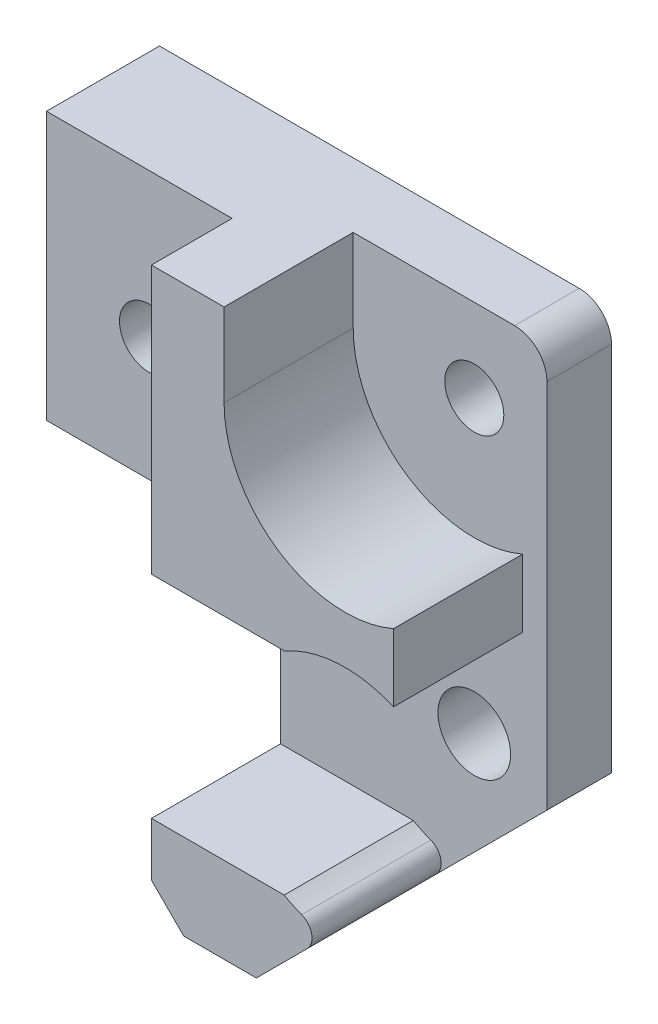
ISO-10303-21;
HEADER;
FILE_DESCRIPTION(('STEP AP214'),'2;1');
FILE_NAME('part.step','',(''),(''),'','','');
FILE_SCHEMA(('AUTOMOTIVE_DESIGN { 1 0 10303 214 1 1 1 1 }'));
ENDSEC;
DATA;
#1=APPLICATION_CONTEXT('core data for automotive mechanical design processes');
#2=APPLICATION_PROTOCOL_DEFINITION('international standard','automotive_design',2000,#1);
#3=PRODUCT_CONTEXT('',#1,'mechanical');
#4=PRODUCT('Part','Part','',(#3));
#5=PRODUCT_RELATED_PRODUCT_CATEGORY('part','',(#4));
#6=PRODUCT_DEFINITION_FORMATION('','',#4);
#7=PRODUCT_DEFINITION_CONTEXT('part definition',#1,'design');
#8=PRODUCT_DEFINITION('design','',#6,#7);
#9=PRODUCT_DEFINITION_SHAPE('','',#8);
#10=(LENGTH_UNIT() NAMED_UNIT(*) SI_UNIT(.MILLI.,.METRE.));
#11=(NAMED_UNIT(*) PLANE_ANGLE_UNIT() SI_UNIT($,.RADIAN.));
#12=(NAMED_UNIT(*) SI_UNIT($,.STERADIAN.) SOLID_ANGLE_UNIT());
#13=UNCERTAINTY_MEASURE_WITH_UNIT(LENGTH_MEASURE(1.E-05),#10,'distance_accuracy_value','');
#14=(GEOMETRIC_REPRESENTATION_CONTEXT(3) GLOBAL_UNCERTAINTY_ASSIGNED_CONTEXT((#13)) GLOBAL_UNIT_ASSIGNED_CONTEXT((#10,
#11,#12)) REPRESENTATION_CONTEXT('',''));
#15=CARTESIAN_POINT('',(0.,0.,0.));
#16=DIRECTION('',(0.,0.,1.));
#17=DIRECTION('',(1.,0.,0.));
#18=AXIS2_PLACEMENT_3D('',#15,#16,#17);
#19=CARTESIAN_POINT('',(23.5,29.8639610306789,8.));
#20=DIRECTION('',(0.,0.,1.));
#21=DIRECTION('',(-1.,0.,0.));
#22=AXIS2_PLACEMENT_3D('',#19,#20,#21);
#23=PLANE('',#22);
#24=DIRECTION('',(1.,0.,0.));
#25=VECTOR('',#24,1.);
#26=CARTESIAN_POINT('',(0.,18.4139610306789,8.));
#27=LINE('',#26,#25);
#28=CARTESIAN_POINT('',(11.5,18.4139610306789,8.));
#29=VERTEX_POINT('',#28);
#30=CARTESIAN_POINT('',(19.7450033288963,18.4139610306789,8.));
#31=VERTEX_POINT('',#30);
#32=EDGE_CURVE('E311',#29,#31,#27,.T.);
#33=ORIENTED_EDGE('',*,*,#32,.T.);
#34=CARTESIAN_POINT('',(23.5,11.8639610306789,8.));
#35=DIRECTION('',(0.,0.,-1.));
#36=DIRECTION('',(-1.,0.,0.));
#37=AXIS2_PLACEMENT_3D('',#34,#35,#36);
#38=CIRCLE('',#37,7.55);
#39=CARTESIAN_POINT('',(26.5,18.7923446805644,8.));
#40=VERTEX_POINT('',#39);
#41=EDGE_CURVE('E335',#31,#40,#38,.T.);
#42=ORIENTED_EDGE('',*,*,#41,.T.);
#43=DIRECTION('',(0.,-1.,0.));
#44=VECTOR('',#43,1.);
#45=CARTESIAN_POINT('',(26.5,0.,8.));
#46=LINE('',#45,#44);
#47=CARTESIAN_POINT('',(26.5,22.9900974882452,8.));
#48=VERTEX_POINT('',#47);
#49=EDGE_CURVE('E294',#48,#40,#46,.T.);
#50=ORIENTED_EDGE('',*,*,#49,.F.);
#51=CARTESIAN_POINT('',(23.5,29.8639610306789,8.));
#52=DIRECTION('',(0.,0.,-1.));
#53=DIRECTION('',(-1.,0.,0.));
#54=AXIS2_PLACEMENT_3D('',#51,#52,#53);
#55=CIRCLE('',#54,7.5);
#56=CARTESIAN_POINT('',(16.,29.8639610306789,8.));
#57=VERTEX_POINT('',#56);
#58=EDGE_CURVE('E321',#48,#57,#55,.T.);
#59=ORIENTED_EDGE('',*,*,#58,.T.);
#60=DIRECTION('',(0.,1.,0.));
#61=VECTOR('',#60,1.);
#62=CARTESIAN_POINT('',(16.,0.,8.));
#63=LINE('',#62,#61);
#64=CARTESIAN_POINT('',(16.,35.,8.));
#65=VERTEX_POINT('',#64);
#66=EDGE_CURVE('E317',#57,#65,#63,.T.);
#67=ORIENTED_EDGE('',*,*,#66,.T.);
#68=DIRECTION('',(1.,0.,0.));
#69=VECTOR('',#68,1.);
#70=CARTESIAN_POINT('',(0.,35.,8.));
#71=LINE('',#70,#69);
#72=CARTESIAN_POINT('',(11.5,35.,8.));
#73=VERTEX_POINT('',#72);
#74=EDGE_CURVE('E325',#73,#65,#71,.T.);
#75=ORIENTED_EDGE('',*,*,#74,.F.);
#76=DIRECTION('',(0.,1.,0.));
#77=VECTOR('',#76,1.);
#78=CARTESIAN_POINT('',(11.5,0.,8.));
#79=LINE('',#78,#77);
#80=EDGE_CURVE('E255',#29,#73,#79,.T.);
#81=ORIENTED_EDGE('',*,*,#80,.F.);
#82=EDGE_LOOP('',(#33,#42,#50,#59,#67,#75,#81));
#83=FACE_BOUND('',#82,.T.);
#84=ADVANCED_FACE('F36',(#83),#23,.T.);
#85=CARTESIAN_POINT('',(0.,0.,-4.));
#86=DIRECTION('',(1.,0.,0.));
#87=DIRECTION('',(0.,0.,1.));
#88=AXIS2_PLACEMENT_3D('',#85,#86,#87);
#89=PLANE('',#88);
#90=DIRECTION('',(0.,1.,0.));
#91=VECTOR('',#90,1.);
#92=CARTESIAN_POINT('',(0.,0.,3.));
#93=LINE('',#92,#91);
#94=CARTESIAN_POINT('',(0.,18.4139610306789,3.));
#95=VERTEX_POINT('',#94);
#96=CARTESIAN_POINT('',(0.,35.,3.));
#97=VERTEX_POINT('',#96);
#98=EDGE_CURVE('E260',#95,#97,#93,.T.);
#99=ORIENTED_EDGE('',*,*,#98,.T.);
#100=DIRECTION('',(0.,0.,1.));
#101=VECTOR('',#100,1.);
#102=CARTESIAN_POINT('',(0.,35.,-4.));
#103=LINE('',#102,#101);
#104=CARTESIAN_POINT('',(0.,35.,-4.));
#105=VERTEX_POINT('',#104);
#106=EDGE_CURVE('E393',#105,#97,#103,.T.);
#107=ORIENTED_EDGE('',*,*,#106,.F.);
#108=DIRECTION('',(0.,-1.,0.));
#109=VECTOR('',#108,1.);
#110=CARTESIAN_POINT('',(0.,0.,-4.));
#111=LINE('',#110,#109);
#112=CARTESIAN_POINT('',(0.,18.4139610306789,-4.));
#113=VERTEX_POINT('',#112);
#114=EDGE_CURVE('E376',#105,#113,#111,.T.);
#115=ORIENTED_EDGE('',*,*,#114,.T.);
#116=DIRECTION('',(0.,0.,1.));
#117=VECTOR('',#116,1.);
#118=CARTESIAN_POINT('',(0.,18.4139610306789,-4.));
#119=LINE('',#118,#117);
#120=EDGE_CURVE('E288',#113,#95,#119,.T.);
#121=ORIENTED_EDGE('',*,*,#120,.T.);
#122=EDGE_LOOP('',(#99,#107,#115,#121));
#123=FACE_BOUND('',#122,.T.);
#124=ADVANCED_FACE('F466',(#123),#89,.F.);
#125=CARTESIAN_POINT('',(0.,35.,-4.));
#126=DIRECTION('',(0.,-1.,0.));
#127=DIRECTION('',(0.,0.,1.));
#128=AXIS2_PLACEMENT_3D('',#125,#126,#127);
#129=PLANE('',#128);
#130=DIRECTION('',(0.,0.,1.));
#131=VECTOR('',#130,1.);
#132=CARTESIAN_POINT('',(11.5,35.,3.));
#133=LINE('',#132,#131);
#134=CARTESIAN_POINT('',(11.5,35.,3.));
#135=VERTEX_POINT('',#134);
#136=EDGE_CURVE('E272',#135,#73,#133,.T.);
#137=ORIENTED_EDGE('',*,*,#136,.T.);
#138=ORIENTED_EDGE('',*,*,#74,.T.);
#139=DIRECTION('',(0.,0.,-1.));
#140=VECTOR('',#139,1.);
#141=CARTESIAN_POINT('',(16.,35.,51.9004555785017));
#142=LINE('',#141,#140);
#143=CARTESIAN_POINT('',(16.,35.,0.));
#144=VERTEX_POINT('',#143);
#145=EDGE_CURVE('E328',#65,#144,#142,.T.);
#146=ORIENTED_EDGE('',*,*,#145,.T.);
#147=DIRECTION('',(-1.,0.,0.));
#148=VECTOR('',#147,1.);
#149=CARTESIAN_POINT('',(0.,35.,0.));
#150=LINE('',#149,#148);
#151=CARTESIAN_POINT('',(26.,35.,0.));
#152=VERTEX_POINT('',#151);
#153=EDGE_CURVE('E380',#152,#144,#150,.T.);
#154=ORIENTED_EDGE('',*,*,#153,.F.);
#155=DIRECTION('',(0.,0.,1.));
#156=VECTOR('',#155,1.);
#157=CARTESIAN_POINT('',(26.,35.,-4.));
#158=LINE('',#157,#156);
#159=CARTESIAN_POINT('',(26.,35.,-4.));
#160=VERTEX_POINT('',#159);
#161=EDGE_CURVE('E405',#160,#152,#158,.T.);
#162=ORIENTED_EDGE('',*,*,#161,.F.);
#163=DIRECTION('',(-1.,0.,0.));
#164=VECTOR('',#163,1.);
#165=CARTESIAN_POINT('',(0.,35.,-4.));
#166=LINE('',#165,#164);
#167=EDGE_CURVE('E391',#160,#105,#166,.T.);
#168=ORIENTED_EDGE('',*,*,#167,.T.);
#169=ORIENTED_EDGE('',*,*,#106,.T.);
#170=DIRECTION('',(1.,0.,0.));
#171=VECTOR('',#170,1.);
#172=CARTESIAN_POINT('',(0.,35.,3.));
#173=LINE('',#172,#171);
#174=EDGE_CURVE('E263',#97,#135,#173,.T.);
#175=ORIENTED_EDGE('',*,*,#174,.T.);
#176=EDGE_LOOP('',(#137,#138,#146,#154,#162,#168,#169,#175));
#177=FACE_BOUND('',#176,.T.);
#178=ADVANCED_FACE('F472',(#177),#129,.F.);
#179=CARTESIAN_POINT('',(0.,18.4139610306789,51.9004555785017));
#180=DIRECTION('',(0.,-1.,0.));
#181=DIRECTION('',(1.,0.,0.));
#182=AXIS2_PLACEMENT_3D('',#179,#180,#181);
#183=PLANE('',#182);
#184=DIRECTION('',(-1.,0.,0.));
#185=VECTOR('',#184,1.);
#186=CARTESIAN_POINT('',(0.,18.4139610306789,3.));
#187=LINE('',#186,#185);
#188=CARTESIAN_POINT('',(11.5,18.4139610306789,3.));
#189=VERTEX_POINT('',#188);
#190=EDGE_CURVE('E258',#189,#95,#187,.T.);
#191=ORIENTED_EDGE('',*,*,#190,.T.);
#192=ORIENTED_EDGE('',*,*,#120,.F.);
#193=DIRECTION('',(1.,0.,0.));
#194=VECTOR('',#193,1.);
#195=CARTESIAN_POINT('',(0.,18.4139610306789,-4.));
#196=LINE('',#195,#194);
#197=CARTESIAN_POINT('',(11.5,18.4139610306789,-4.));
#198=VERTEX_POINT('',#197);
#199=EDGE_CURVE('E282',#113,#198,#196,.T.);
#200=ORIENTED_EDGE('',*,*,#199,.T.);
#201=DIRECTION('',(0.,0.,1.));
#202=VECTOR('',#201,1.);
#203=CARTESIAN_POINT('',(11.5,18.4139610306789,-4.));
#204=LINE('',#203,#202);
#205=CARTESIAN_POINT('',(11.5,18.4139610306789,0.));
#206=VERTEX_POINT('',#205);
#207=EDGE_CURVE('E291',#198,#206,#204,.T.);
#208=ORIENTED_EDGE('',*,*,#207,.T.);
#209=DIRECTION('',(1.,0.,0.));
#210=VECTOR('',#209,1.);
#211=CARTESIAN_POINT('',(0.,18.4139610306789,0.));
#212=LINE('',#211,#210);
#213=CARTESIAN_POINT('',(19.7450033288963,18.4139610306789,0.));
#214=VERTEX_POINT('',#213);
#215=EDGE_CURVE('E303',#206,#214,#212,.T.);
#216=ORIENTED_EDGE('',*,*,#215,.T.);
#217=DIRECTION('',(0.,0.,-1.));
#218=VECTOR('',#217,1.);
#219=CARTESIAN_POINT('',(19.7450033288963,18.4139610306789,51.9004555785017));
#220=LINE('',#219,#218);
#221=EDGE_CURVE('E339',#31,#214,#220,.T.);
#222=ORIENTED_EDGE('',*,*,#221,.F.);
#223=ORIENTED_EDGE('',*,*,#32,.F.);
#224=DIRECTION('',(0.,0.,1.));
#225=VECTOR('',#224,1.);
#226=CARTESIAN_POINT('',(11.5,18.4139610306789,3.));
#227=LINE('',#226,#225);
#228=EDGE_CURVE('E269',#189,#29,#227,.T.);
#229=ORIENTED_EDGE('',*,*,#228,.F.);
#230=EDGE_LOOP('',(#191,#192,#200,#208,#216,#222,#223,#229));
#231=FACE_BOUND('',#230,.T.);
#232=ADVANCED_FACE('F460',(#231),#183,.T.);
#233=CARTESIAN_POINT('',(6.35,26.,-4.));
#234=DIRECTION('',(0.,0.,-1.));
#235=DIRECTION('',(1.,0.,0.));
#236=AXIS2_PLACEMENT_3D('',#233,#234,#235);
#237=CYLINDRICAL_SURFACE('',#236,1.8288);
#238=CARTESIAN_POINT('',(6.35,26.,-0.4948));
#239=DIRECTION('',(0.,0.,1.));
#240=DIRECTION('',(1.,0.,0.));
#241=AXIS2_PLACEMENT_3D('',#238,#239,#240);
#242=CIRCLE('',#241,1.8288);
#243=CARTESIAN_POINT('',(8.1788,26.,-0.4948));
#244=VERTEX_POINT('',#243);
#245=EDGE_CURVE('E274',#244,#244,#242,.T.);
#246=ORIENTED_EDGE('',*,*,#245,.F.);
#247=EDGE_LOOP('',(#246));
#248=FACE_BOUND('',#247,.T.);
#249=CARTESIAN_POINT('',(6.35,26.,3.));
#250=DIRECTION('',(0.,0.,-1.));
#251=DIRECTION('',(-1.,0.,0.));
#252=AXIS2_PLACEMENT_3D('',#249,#250,#251);
#253=CIRCLE('',#252,1.8288);
#254=CARTESIAN_POINT('',(4.5212,26.,3.));
#255=VERTEX_POINT('',#254);
#256=EDGE_CURVE('E266',#255,#255,#253,.F.);
#257=ORIENTED_EDGE('',*,*,#256,.T.);
#258=EDGE_LOOP('',(#257));
#259=FACE_BOUND('',#258,.T.);
#260=ADVANCED_FACE('F508',(#248,#259),#237,.F.);
#261=CARTESIAN_POINT('',(26.,33.,0.));
#262=DIRECTION('',(0.,0.,-1.));
#263=DIRECTION('',(1.,0.,0.));
#264=AXIS2_PLACEMENT_3D('',#261,#262,#263);
#265=PLANE('',#264);
#266=CARTESIAN_POINT('',(23.5,29.8639610306789,0.));
#267=DIRECTION('',(0.,0.,-1.));
#268=DIRECTION('',(-1.,0.,0.));
#269=AXIS2_PLACEMENT_3D('',#266,#267,#268);
#270=CIRCLE('',#269,1.8288);
#271=CARTESIAN_POINT('',(25.3288,29.8639610306789,0.));
#272=VERTEX_POINT('',#271);
#273=EDGE_CURVE('E822',#272,#272,#270,.T.);
#274=ORIENTED_EDGE('',*,*,#273,.T.);
#275=EDGE_LOOP('',(#274));
#276=FACE_BOUND('',#275,.T.);
#277=CARTESIAN_POINT('',(23.5,29.8639610306789,0.));
#278=DIRECTION('',(0.,0.,-1.));
#279=DIRECTION('',(-1.,0.,0.));
#280=AXIS2_PLACEMENT_3D('',#277,#278,#279);
#281=CIRCLE('',#280,7.5);
#282=CARTESIAN_POINT('',(26.5,22.9900974882452,0.));
#283=VERTEX_POINT('',#282);
#284=CARTESIAN_POINT('',(16.,29.8639610306789,0.));
#285=VERTEX_POINT('',#284);
#286=EDGE_CURVE('E300',#283,#285,#281,.T.);
#287=ORIENTED_EDGE('',*,*,#286,.F.);
#288=DIRECTION('',(0.,-1.,0.));
#289=VECTOR('',#288,1.);
#290=CARTESIAN_POINT('',(26.5,0.,0.));
#291=LINE('',#290,#289);
#292=CARTESIAN_POINT('',(26.5,18.7923446805644,0.));
#293=VERTEX_POINT('',#292);
#294=EDGE_CURVE('E318',#283,#293,#291,.T.);
#295=ORIENTED_EDGE('',*,*,#294,.T.);
#296=CARTESIAN_POINT('',(23.5,11.8639610306789,0.));
#297=DIRECTION('',(0.,0.,-1.));
#298=DIRECTION('',(-1.,0.,0.));
#299=AXIS2_PLACEMENT_3D('',#296,#297,#298);
#300=CIRCLE('',#299,7.55);
#301=EDGE_CURVE('E314',#214,#293,#300,.T.);
#302=ORIENTED_EDGE('',*,*,#301,.F.);
#303=ORIENTED_EDGE('',*,*,#215,.F.);
#304=DIRECTION('',(0.,-1.,0.));
#305=VECTOR('',#304,1.);
#306=CARTESIAN_POINT('',(11.5,0.,0.));
#307=LINE('',#306,#305);
#308=CARTESIAN_POINT('',(11.5,5.31396103067893,0.));
#309=VERTEX_POINT('',#308);
#310=EDGE_CURVE('E278',#206,#309,#307,.T.);
#311=ORIENTED_EDGE('',*,*,#310,.T.);
#312=DIRECTION('',(1.,0.,0.));
#313=VECTOR('',#312,1.);
#314=CARTESIAN_POINT('',(0.,5.31396103067893,0.));
#315=LINE('',#314,#313);
#316=CARTESIAN_POINT('',(19.725,5.31396103067893,0.));
#317=VERTEX_POINT('',#316);
#318=EDGE_CURVE('E307',#309,#317,#315,.T.);
#319=ORIENTED_EDGE('',*,*,#318,.T.);
#320=CARTESIAN_POINT('',(23.5,11.8639610306789,0.));
#321=DIRECTION('',(0.,0.,-1.));
#322=DIRECTION('',(-1.,0.,0.));
#323=AXIS2_PLACEMENT_3D('',#320,#321,#322);
#324=CIRCLE('',#323,7.55996858459081);
#325=CARTESIAN_POINT('',(20.807324797528,4.79978200874067,0.));
#326=VERTEX_POINT('',#325);
#327=EDGE_CURVE('E304',#317,#326,#324,.F.);
#328=ORIENTED_EDGE('',*,*,#327,.T.);
#329=CARTESIAN_POINT('',(20.451149348868,3.86536291124113,0.));
#330=DIRECTION('',(0.,0.,-1.));
#331=DIRECTION('',(-1.,0.,0.));
#332=AXIS2_PLACEMENT_3D('',#329,#330,#331);
#333=CIRCLE('',#332,0.999999999999998);
#334=CARTESIAN_POINT('',(21.1582561300546,3.15825613005459,0.));
#335=VERTEX_POINT('',#334);
#336=EDGE_CURVE('E299',#335,#326,#333,.F.);
#337=ORIENTED_EDGE('',*,*,#336,.F.);
#338=DIRECTION('',(0.707106781186547,0.707106781186548,0.));
#339=VECTOR('',#338,1.);
#340=CARTESIAN_POINT('',(18.,0.,0.));
#341=LINE('',#340,#339);
#342=CARTESIAN_POINT('',(28.,10.,0.));
#343=VERTEX_POINT('',#342);
#344=EDGE_CURVE('E373',#335,#343,#341,.T.);
#345=ORIENTED_EDGE('',*,*,#344,.T.);
#346=DIRECTION('',(0.,1.,0.));
#347=VECTOR('',#346,1.);
#348=CARTESIAN_POINT('',(28.,10.,0.));
#349=LINE('',#348,#347);
#350=CARTESIAN_POINT('',(28.,33.,0.));
#351=VERTEX_POINT('',#350);
#352=EDGE_CURVE('E396',#343,#351,#349,.T.);
#353=ORIENTED_EDGE('',*,*,#352,.T.);
#354=CARTESIAN_POINT('',(26.,33.,0.));
#355=DIRECTION('',(0.,0.,1.));
#356=DIRECTION('',(1.,0.,0.));
#357=AXIS2_PLACEMENT_3D('',#354,#355,#356);
#358=CIRCLE('',#357,2.);
#359=EDGE_CURVE('E399',#351,#152,#358,.T.);
#360=ORIENTED_EDGE('',*,*,#359,.T.);
#361=ORIENTED_EDGE('',*,*,#153,.T.);
#362=DIRECTION('',(0.,1.,0.));
#363=VECTOR('',#362,1.);
#364=CARTESIAN_POINT('',(16.,0.,0.));
#365=LINE('',#364,#363);
#366=EDGE_CURVE('E297',#285,#144,#365,.T.);
#367=ORIENTED_EDGE('',*,*,#366,.F.);
#368=EDGE_LOOP('',(#287,#295,#302,#303,#311,#319,#328,#337,#345,#353,#360,#361,#367));
#369=FACE_BOUND('',#368,.T.);
#370=CARTESIAN_POINT('',(23.5,11.8639610306789,0.));
#371=DIRECTION('',(0.,0.,-1.));
#372=DIRECTION('',(-1.,0.,0.));
#373=AXIS2_PLACEMENT_3D('',#370,#371,#372);
#374=CIRCLE('',#373,2.25);
#375=CARTESIAN_POINT('',(21.25,11.8639610306789,0.));
#376=VERTEX_POINT('',#375);
#377=EDGE_CURVE('E369',#376,#376,#374,.T.);
#378=ORIENTED_EDGE('',*,*,#377,.T.);
#379=EDGE_LOOP('',(#378));
#380=FACE_BOUND('',#379,.T.);
#381=ADVANCED_FACE('F457',(#276,#369,#380),#265,.F.);
#382=CARTESIAN_POINT('',(0.,0.,-4.));
#383=DIRECTION('',(0.,1.,0.));
#384=DIRECTION('',(0.,0.,-1.));
#385=AXIS2_PLACEMENT_3D('',#382,#383,#384);
#386=PLANE('',#385);
#387=DIRECTION('',(1.,0.,0.));
#388=VECTOR('',#387,1.);
#389=CARTESIAN_POINT('',(0.,0.,-4.));
#390=LINE('',#389,#388);
#391=CARTESIAN_POINT('',(13.5,0.,-4.));
#392=VERTEX_POINT('',#391);
#393=CARTESIAN_POINT('',(18.,0.,-4.));
#394=VERTEX_POINT('',#393);
#395=EDGE_CURVE('E379',#392,#394,#390,.T.);
#396=ORIENTED_EDGE('',*,*,#395,.T.);
#397=DIRECTION('',(0.,0.,1.));
#398=VECTOR('',#397,1.);
#399=CARTESIAN_POINT('',(18.,0.,-4.));
#400=LINE('',#399,#398);
#401=CARTESIAN_POINT('',(18.,0.,8.));
#402=VERTEX_POINT('',#401);
#403=EDGE_CURVE('E412',#394,#402,#400,.T.);
#404=ORIENTED_EDGE('',*,*,#403,.T.);
#405=DIRECTION('',(-1.,0.,0.));
#406=VECTOR('',#405,1.);
#407=CARTESIAN_POINT('',(0.,0.,8.));
#408=LINE('',#407,#406);
#409=CARTESIAN_POINT('',(13.5,0.,8.));
#410=VERTEX_POINT('',#409);
#411=EDGE_CURVE('E354',#402,#410,#408,.T.);
#412=ORIENTED_EDGE('',*,*,#411,.T.);
#413=DIRECTION('',(0.,0.,1.));
#414=VECTOR('',#413,1.);
#415=CARTESIAN_POINT('',(13.5,0.,-4.));
#416=LINE('',#415,#414);
#417=EDGE_CURVE('E417',#392,#410,#416,.T.);
#418=ORIENTED_EDGE('',*,*,#417,.F.);
#419=EDGE_LOOP('',(#396,#404,#412,#418));
#420=FACE_BOUND('',#419,.T.);
#421=ADVANCED_FACE('F439',(#420),#386,.F.);
#422=CARTESIAN_POINT('',(18.,0.,-4.));
#423=DIRECTION('',(-0.707106781186548,0.707106781186547,0.));
#424=DIRECTION('',(-0.707106781186547,-0.707106781186548,0.));
#425=AXIS2_PLACEMENT_3D('',#422,#423,#424);
#426=PLANE('',#425);
#427=ORIENTED_EDGE('',*,*,#403,.F.);
#428=DIRECTION('',(0.707106781186547,0.707106781186548,0.));
#429=VECTOR('',#428,1.);
#430=CARTESIAN_POINT('',(18.,0.,-4.));
#431=LINE('',#430,#429);
#432=CARTESIAN_POINT('',(28.,10.,-4.));
#433=VERTEX_POINT('',#432);
#434=EDGE_CURVE('E383',#394,#433,#431,.T.);
#435=ORIENTED_EDGE('',*,*,#434,.T.);
#436=DIRECTION('',(0.,0.,1.));
#437=VECTOR('',#436,1.);
#438=CARTESIAN_POINT('',(28.,10.,-4.));
#439=LINE('',#438,#437);
#440=EDGE_CURVE('E410',#433,#343,#439,.T.);
#441=ORIENTED_EDGE('',*,*,#440,.T.);
#442=ORIENTED_EDGE('',*,*,#344,.F.);
#443=DIRECTION('',(0.,0.,-1.));
#444=VECTOR('',#443,1.);
#445=CARTESIAN_POINT('',(21.1582561300546,3.15825613005459,51.9004555785017));
#446=LINE('',#445,#444);
#447=CARTESIAN_POINT('',(21.1582561300546,3.15825613005459,8.));
#448=VERTEX_POINT('',#447);
#449=EDGE_CURVE('E352',#448,#335,#446,.T.);
#450=ORIENTED_EDGE('',*,*,#449,.F.);
#451=DIRECTION('',(-0.707106781186548,-0.707106781186548,0.));
#452=VECTOR('',#451,1.);
#453=CARTESIAN_POINT('',(9.,-9.,8.));
#454=LINE('',#453,#452);
#455=EDGE_CURVE('E347',#448,#402,#454,.T.);
#456=ORIENTED_EDGE('',*,*,#455,.T.);
#457=EDGE_LOOP('',(#427,#435,#441,#442,#450,#456));
#458=FACE_BOUND('',#457,.T.);
#459=ADVANCED_FACE('F445',(#458),#426,.F.);
#460=CARTESIAN_POINT('',(28.,10.,-4.));
#461=DIRECTION('',(-1.,0.,0.));
#462=DIRECTION('',(0.,-1.,0.));
#463=AXIS2_PLACEMENT_3D('',#460,#461,#462);
#464=PLANE('',#463);
#465=ORIENTED_EDGE('',*,*,#352,.F.);
#466=ORIENTED_EDGE('',*,*,#440,.F.);
#467=DIRECTION('',(0.,1.,0.));
#468=VECTOR('',#467,1.);
#469=CARTESIAN_POINT('',(28.,10.,-4.));
#470=LINE('',#469,#468);
#471=CARTESIAN_POINT('',(28.,33.,-4.));
#472=VERTEX_POINT('',#471);
#473=EDGE_CURVE('E386',#433,#472,#470,.T.);
#474=ORIENTED_EDGE('',*,*,#473,.T.);
#475=DIRECTION('',(0.,0.,1.));
#476=VECTOR('',#475,1.);
#477=CARTESIAN_POINT('',(28.,33.,-4.));
#478=LINE('',#477,#476);
#479=EDGE_CURVE('E408',#472,#351,#478,.T.);
#480=ORIENTED_EDGE('',*,*,#479,.T.);
#481=EDGE_LOOP('',(#465,#466,#474,#480));
#482=FACE_BOUND('',#481,.T.);
#483=ADVANCED_FACE('F479',(#482),#464,.F.);
#484=CARTESIAN_POINT('',(26.,33.,-4.));
#485=DIRECTION('',(0.,0.,1.));
#486=DIRECTION('',(-1.,0.,0.));
#487=AXIS2_PLACEMENT_3D('',#484,#485,#486);
#488=CYLINDRICAL_SURFACE('',#487,2.);
#489=ORIENTED_EDGE('',*,*,#359,.F.);
#490=ORIENTED_EDGE('',*,*,#479,.F.);
#491=CARTESIAN_POINT('',(26.,33.,-4.));
#492=DIRECTION('',(0.,0.,1.));
#493=DIRECTION('',(1.,0.,0.));
#494=AXIS2_PLACEMENT_3D('',#491,#492,#493);
#495=CIRCLE('',#494,2.);
#496=EDGE_CURVE('E389',#472,#160,#495,.T.);
#497=ORIENTED_EDGE('',*,*,#496,.T.);
#498=ORIENTED_EDGE('',*,*,#161,.T.);
#499=EDGE_LOOP('',(#489,#490,#497,#498));
#500=FACE_BOUND('',#499,.T.);
#501=ADVANCED_FACE('F475',(#500),#488,.T.);
#502=CARTESIAN_POINT('',(26.,33.,-4.));
#503=DIRECTION('',(0.,0.,-1.));
#504=DIRECTION('',(1.,0.,0.));
#505=AXIS2_PLACEMENT_3D('',#502,#503,#504);
#506=PLANE('',#505);
#507=CARTESIAN_POINT('',(23.5,29.8639610306789,-4.));
#508=DIRECTION('',(0.,0.,1.));
#509=DIRECTION('',(1.,0.,0.));
#510=AXIS2_PLACEMENT_3D('',#507,#508,#509);
#511=CIRCLE('',#510,1.8288);
#512=CARTESIAN_POINT('',(25.3288,29.8639610306789,-4.));
#513=VERTEX_POINT('',#512);
#514=EDGE_CURVE('E825',#513,#513,#511,.T.);
#515=ORIENTED_EDGE('',*,*,#514,.T.);
#516=EDGE_LOOP('',(#515));
#517=FACE_BOUND('',#516,.T.);
#518=DIRECTION('',(0.866025403784438,0.500000000000001,0.));
#519=VECTOR('',#518,1.);
#520=CARTESIAN_POINT('',(2.22500000000001,28.3815698604072,-4.));
#521=LINE('',#520,#519);
#522=CARTESIAN_POINT('',(2.22500000000001,28.3815698604072,-4.));
#523=VERTEX_POINT('',#522);
#524=CARTESIAN_POINT('',(6.35,30.7631397208144,-4.));
#525=VERTEX_POINT('',#524);
#526=EDGE_CURVE('E224',#523,#525,#521,.T.);
#527=ORIENTED_EDGE('',*,*,#526,.F.);
#528=DIRECTION('',(0.,1.,0.));
#529=VECTOR('',#528,1.);
#530=CARTESIAN_POINT('',(2.22500000000001,23.6184301395928,-4.));
#531=LINE('',#530,#529);
#532=CARTESIAN_POINT('',(2.22500000000001,23.6184301395928,-4.));
#533=VERTEX_POINT('',#532);
#534=EDGE_CURVE('E236',#533,#523,#531,.T.);
#535=ORIENTED_EDGE('',*,*,#534,.F.);
#536=DIRECTION('',(-0.866025403784438,0.5,0.));
#537=VECTOR('',#536,1.);
#538=CARTESIAN_POINT('',(6.35,21.2368602791856,-4.));
#539=LINE('',#538,#537);
#540=CARTESIAN_POINT('',(6.35,21.2368602791856,-4.));
#541=VERTEX_POINT('',#540);
#542=EDGE_CURVE('E51',#541,#533,#539,.T.);
#543=ORIENTED_EDGE('',*,*,#542,.F.);
#544=DIRECTION('',(-0.866025403784438,-0.5,0.));
#545=VECTOR('',#544,1.);
#546=CARTESIAN_POINT('',(10.475,23.6184301395928,-4.));
#547=LINE('',#546,#545);
#548=CARTESIAN_POINT('',(10.475,23.6184301395928,-4.));
#549=VERTEX_POINT('',#548);
#550=EDGE_CURVE('E232',#549,#541,#547,.T.);
#551=ORIENTED_EDGE('',*,*,#550,.F.);
#552=DIRECTION('',(0.,-1.,0.));
#553=VECTOR('',#552,1.);
#554=CARTESIAN_POINT('',(10.475,28.3815698604072,-4.));
#555=LINE('',#554,#553);
#556=CARTESIAN_POINT('',(10.475,28.3815698604072,-4.));
#557=VERTEX_POINT('',#556);
#558=EDGE_CURVE('E813',#557,#549,#555,.T.);
#559=ORIENTED_EDGE('',*,*,#558,.F.);
#560=DIRECTION('',(0.866025403784438,-0.5,0.));
#561=VECTOR('',#560,1.);
#562=CARTESIAN_POINT('',(6.35,30.7631397208144,-4.));
#563=LINE('',#562,#561);
#564=EDGE_CURVE('E815',#525,#557,#563,.T.);
#565=ORIENTED_EDGE('',*,*,#564,.F.);
#566=EDGE_LOOP('',(#527,#535,#543,#551,#559,#565));
#567=FACE_BOUND('',#566,.T.);
#568=DIRECTION('',(0.,-1.,0.));
#569=VECTOR('',#568,1.);
#570=CARTESIAN_POINT('',(11.5,0.,-4.));
#571=LINE('',#570,#569);
#572=CARTESIAN_POINT('',(11.5,2.,-4.));
#573=VERTEX_POINT('',#572);
#574=EDGE_CURVE('E285',#198,#573,#571,.T.);
#575=ORIENTED_EDGE('',*,*,#574,.F.);
#576=ORIENTED_EDGE('',*,*,#199,.F.);
#577=ORIENTED_EDGE('',*,*,#114,.F.);
#578=ORIENTED_EDGE('',*,*,#167,.F.);
#579=ORIENTED_EDGE('',*,*,#496,.F.);
#580=ORIENTED_EDGE('',*,*,#473,.F.);
#581=ORIENTED_EDGE('',*,*,#434,.F.);
#582=ORIENTED_EDGE('',*,*,#395,.F.);
#583=DIRECTION('',(-0.707106781186545,0.70710678118655,0.));
#584=VECTOR('',#583,1.);
#585=CARTESIAN_POINT('',(3.24999999999995,10.2500000000001,-4.));
#586=LINE('',#585,#584);
#587=EDGE_CURVE('E11',#573,#392,#586,.F.);
#588=ORIENTED_EDGE('',*,*,#587,.F.);
#589=EDGE_LOOP('',(#575,#576,#577,#578,#579,#580,#581,#582,#588));
#590=FACE_BOUND('',#589,.T.);
#591=CARTESIAN_POINT('',(23.5,11.8639610306789,-4.));
#592=DIRECTION('',(0.,0.,-1.));
#593=DIRECTION('',(-1.,0.,0.));
#594=AXIS2_PLACEMENT_3D('',#591,#592,#593);
#595=CIRCLE('',#594,2.25);
#596=CARTESIAN_POINT('',(21.25,11.8639610306789,-4.));
#597=VERTEX_POINT('',#596);
#598=EDGE_CURVE('E370',#597,#597,#595,.T.);
#599=ORIENTED_EDGE('',*,*,#598,.F.);
#600=EDGE_LOOP('',(#599));
#601=FACE_BOUND('',#600,.T.);
#602=ADVANCED_FACE('F433',(#517,#567,#590,#601),#506,.T.);
#603=CARTESIAN_POINT('',(23.5,11.8639610306789,-4.));
#604=DIRECTION('',(0.,0.,1.));
#605=DIRECTION('',(-1.,0.,0.));
#606=AXIS2_PLACEMENT_3D('',#603,#604,#605);
#607=CYLINDRICAL_SURFACE('',#606,2.25);
#608=ORIENTED_EDGE('',*,*,#598,.T.);
#609=EDGE_LOOP('',(#608));
#610=FACE_BOUND('',#609,.T.);
#611=ORIENTED_EDGE('',*,*,#377,.F.);
#612=EDGE_LOOP('',(#611));
#613=FACE_BOUND('',#612,.T.);
#614=ADVANCED_FACE('F530',(#610,#613),#607,.F.);
#615=ORIENTED_EDGE('',*,*,#411,.F.);
#616=ORIENTED_EDGE('',*,*,#455,.F.);
#617=CARTESIAN_POINT('',(20.451149348868,3.86536291124113,8.));
#618=DIRECTION('',(0.,0.,-1.));
#619=DIRECTION('',(-1.,0.,0.));
#620=AXIS2_PLACEMENT_3D('',#617,#618,#619);
#621=CIRCLE('',#620,0.999999999999998);
#622=CARTESIAN_POINT('',(20.807324797528,4.79978200874067,8.));
#623=VERTEX_POINT('',#622);
#624=EDGE_CURVE('E348',#448,#623,#621,.F.);
#625=ORIENTED_EDGE('',*,*,#624,.T.);
#626=CARTESIAN_POINT('',(23.5,11.8639610306789,8.));
#627=DIRECTION('',(0.,0.,-1.));
#628=DIRECTION('',(-1.,0.,0.));
#629=AXIS2_PLACEMENT_3D('',#626,#627,#628);
#630=CIRCLE('',#629,7.55996858459081);
#631=CARTESIAN_POINT('',(19.725,5.31396103067893,8.));
#632=VERTEX_POINT('',#631);
#633=EDGE_CURVE('E344',#632,#623,#630,.F.);
#634=ORIENTED_EDGE('',*,*,#633,.F.);
#635=DIRECTION('',(1.,0.,0.));
#636=VECTOR('',#635,1.);
#637=CARTESIAN_POINT('',(0.,5.31396103067893,8.));
#638=LINE('',#637,#636);
#639=CARTESIAN_POINT('',(11.5,5.31396103067893,8.));
#640=VERTEX_POINT('',#639);
#641=EDGE_CURVE('E334',#640,#632,#638,.T.);
#642=ORIENTED_EDGE('',*,*,#641,.F.);
#643=DIRECTION('',(0.,-1.,0.));
#644=VECTOR('',#643,1.);
#645=CARTESIAN_POINT('',(11.5,0.,8.));
#646=LINE('',#645,#644);
#647=CARTESIAN_POINT('',(11.5,2.00000000000001,8.));
#648=VERTEX_POINT('',#647);
#649=EDGE_CURVE('E281',#640,#648,#646,.T.);
#650=ORIENTED_EDGE('',*,*,#649,.T.);
#651=DIRECTION('',(0.707106781186545,-0.70710678118655,0.));
#652=VECTOR('',#651,1.);
#653=CARTESIAN_POINT('',(3.5680194846605,9.93198051533956,8.));
#654=LINE('',#653,#652);
#655=EDGE_CURVE('E420',#410,#648,#654,.F.);
#656=ORIENTED_EDGE('',*,*,#655,.F.);
#657=EDGE_LOOP('',(#615,#616,#625,#634,#642,#650,#656));
#658=FACE_BOUND('',#657,.T.);
#659=ADVANCED_FACE('F426',(#658),#23,.T.);
#660=CARTESIAN_POINT('',(16.,0.,51.9004555785017));
#661=DIRECTION('',(1.,0.,0.));
#662=DIRECTION('',(0.,0.,1.));
#663=AXIS2_PLACEMENT_3D('',#660,#661,#662);
#664=PLANE('',#663);
#665=DIRECTION('',(0.,0.,-1.));
#666=VECTOR('',#665,1.);
#667=CARTESIAN_POINT('',(16.,29.8639610306789,51.9004555785017));
#668=LINE('',#667,#666);
#669=EDGE_CURVE('E331',#57,#285,#668,.T.);
#670=ORIENTED_EDGE('',*,*,#669,.T.);
#671=ORIENTED_EDGE('',*,*,#366,.T.);
#672=ORIENTED_EDGE('',*,*,#145,.F.);
#673=ORIENTED_EDGE('',*,*,#66,.F.);
#674=EDGE_LOOP('',(#670,#671,#672,#673));
#675=FACE_BOUND('',#674,.T.);
#676=ADVANCED_FACE('F484',(#675),#664,.T.);
#677=CARTESIAN_POINT('',(20.451149348868,3.86536291124113,51.9004555785017));
#678=DIRECTION('',(0.,0.,-1.));
#679=DIRECTION('',(1.,0.,0.));
#680=AXIS2_PLACEMENT_3D('',#677,#678,#679);
#681=CYLINDRICAL_SURFACE('',#680,0.999999999999998);
#682=ORIENTED_EDGE('',*,*,#449,.T.);
#683=ORIENTED_EDGE('',*,*,#336,.T.);
#684=DIRECTION('',(0.,0.,-1.));
#685=VECTOR('',#684,1.);
#686=CARTESIAN_POINT('',(20.807324797528,4.79978200874067,51.9004555785017));
#687=LINE('',#686,#685);
#688=EDGE_CURVE('E351',#623,#326,#687,.T.);
#689=ORIENTED_EDGE('',*,*,#688,.F.);
#690=ORIENTED_EDGE('',*,*,#624,.F.);
#691=EDGE_LOOP('',(#682,#683,#689,#690));
#692=FACE_BOUND('',#691,.T.);
#693=ADVANCED_FACE('F448',(#692),#681,.T.);
#694=CARTESIAN_POINT('',(23.5,11.8639610306789,51.9004555785017));
#695=DIRECTION('',(0.,0.,-1.));
#696=DIRECTION('',(1.,0.,0.));
#697=AXIS2_PLACEMENT_3D('',#694,#695,#696);
#698=CYLINDRICAL_SURFACE('',#697,7.55996858459081);
#699=ORIENTED_EDGE('',*,*,#633,.T.);
#700=ORIENTED_EDGE('',*,*,#688,.T.);
#701=ORIENTED_EDGE('',*,*,#327,.F.);
#702=DIRECTION('',(0.,0.,-1.));
#703=VECTOR('',#702,1.);
#704=CARTESIAN_POINT('',(19.725,5.31396103067893,51.9004555785017));
#705=LINE('',#704,#703);
#706=EDGE_CURVE('E308',#632,#317,#705,.T.);
#707=ORIENTED_EDGE('',*,*,#706,.F.);
#708=EDGE_LOOP('',(#699,#700,#701,#707));
#709=FACE_BOUND('',#708,.T.);
#710=ADVANCED_FACE('F451',(#709),#698,.F.);
#711=CARTESIAN_POINT('',(0.,5.31396103067893,51.9004555785017));
#712=DIRECTION('',(0.,-1.,0.));
#713=DIRECTION('',(1.,0.,0.));
#714=AXIS2_PLACEMENT_3D('',#711,#712,#713);
#715=PLANE('',#714);
#716=ORIENTED_EDGE('',*,*,#641,.T.);
#717=ORIENTED_EDGE('',*,*,#706,.T.);
#718=ORIENTED_EDGE('',*,*,#318,.F.);
#719=DIRECTION('',(0.,0.,1.));
#720=VECTOR('',#719,1.);
#721=CARTESIAN_POINT('',(11.5,5.31396103067893,-4.));
#722=LINE('',#721,#720);
#723=EDGE_CURVE('E415',#309,#640,#722,.T.);
#724=ORIENTED_EDGE('',*,*,#723,.T.);
#725=EDGE_LOOP('',(#716,#717,#718,#724));
#726=FACE_BOUND('',#725,.T.);
#727=ADVANCED_FACE('F453',(#726),#715,.F.);
#728=CARTESIAN_POINT('',(23.5,11.8639610306789,51.9004555785017));
#729=DIRECTION('',(0.,0.,-1.));
#730=DIRECTION('',(1.,0.,0.));
#731=AXIS2_PLACEMENT_3D('',#728,#729,#730);
#732=CYLINDRICAL_SURFACE('',#731,7.55);
#733=ORIENTED_EDGE('',*,*,#221,.T.);
#734=ORIENTED_EDGE('',*,*,#301,.T.);
#735=DIRECTION('',(0.,0.,-1.));
#736=VECTOR('',#735,1.);
#737=CARTESIAN_POINT('',(26.5,18.7923446805644,51.9004555785017));
#738=LINE('',#737,#736);
#739=EDGE_CURVE('E338',#40,#293,#738,.T.);
#740=ORIENTED_EDGE('',*,*,#739,.F.);
#741=ORIENTED_EDGE('',*,*,#41,.F.);
#742=EDGE_LOOP('',(#733,#734,#740,#741));
#743=FACE_BOUND('',#742,.T.);
#744=ADVANCED_FACE('F494',(#743),#732,.F.);
#745=CARTESIAN_POINT('',(26.5,0.,51.9004555785017));
#746=DIRECTION('',(-1.,0.,0.));
#747=DIRECTION('',(0.,-1.,0.));
#748=AXIS2_PLACEMENT_3D('',#745,#746,#747);
#749=PLANE('',#748);
#750=ORIENTED_EDGE('',*,*,#49,.T.);
#751=ORIENTED_EDGE('',*,*,#739,.T.);
#752=ORIENTED_EDGE('',*,*,#294,.F.);
#753=DIRECTION('',(0.,0.,-1.));
#754=VECTOR('',#753,1.);
#755=CARTESIAN_POINT('',(26.5,22.9900974882452,51.9004555785017));
#756=LINE('',#755,#754);
#757=EDGE_CURVE('E322',#48,#283,#756,.T.);
#758=ORIENTED_EDGE('',*,*,#757,.F.);
#759=EDGE_LOOP('',(#750,#751,#752,#758));
#760=FACE_BOUND('',#759,.T.);
#761=ADVANCED_FACE('F491',(#760),#749,.F.);
#762=CARTESIAN_POINT('',(23.5,29.8639610306789,51.9004555785017));
#763=DIRECTION('',(0.,0.,-1.));
#764=DIRECTION('',(1.,0.,0.));
#765=AXIS2_PLACEMENT_3D('',#762,#763,#764);
#766=CYLINDRICAL_SURFACE('',#765,7.5);
#767=ORIENTED_EDGE('',*,*,#757,.T.);
#768=ORIENTED_EDGE('',*,*,#286,.T.);
#769=ORIENTED_EDGE('',*,*,#669,.F.);
#770=ORIENTED_EDGE('',*,*,#58,.F.);
#771=EDGE_LOOP('',(#767,#768,#769,#770));
#772=FACE_BOUND('',#771,.T.);
#773=ADVANCED_FACE('F487',(#772),#766,.F.);
#774=CARTESIAN_POINT('',(11.5,0.,-4.));
#775=DIRECTION('',(1.,0.,0.));
#776=DIRECTION('',(0.,0.,1.));
#777=AXIS2_PLACEMENT_3D('',#774,#775,#776);
#778=PLANE('',#777);
#779=ORIENTED_EDGE('',*,*,#649,.F.);
#780=ORIENTED_EDGE('',*,*,#723,.F.);
#781=ORIENTED_EDGE('',*,*,#310,.F.);
#782=ORIENTED_EDGE('',*,*,#207,.F.);
#783=ORIENTED_EDGE('',*,*,#574,.T.);
#784=DIRECTION('',(0.,0.,-1.));
#785=VECTOR('',#784,1.);
#786=CARTESIAN_POINT('',(11.5,2.00000000000001,-4.));
#787=LINE('',#786,#785);
#788=EDGE_CURVE('E44',#648,#573,#787,.T.);
#789=ORIENTED_EDGE('',*,*,#788,.F.);
#790=EDGE_LOOP('',(#779,#780,#781,#782,#783,#789));
#791=FACE_BOUND('',#790,.T.);
#792=ADVANCED_FACE('F429',(#791),#778,.F.);
#793=CARTESIAN_POINT('',(8.1788,26.,-0.4948));
#794=DIRECTION('',(0.,0.,1.));
#795=DIRECTION('',(-1.,0.,0.));
#796=AXIS2_PLACEMENT_3D('',#793,#794,#795);
#797=PLANE('',#796);
#798=ORIENTED_EDGE('',*,*,#245,.T.);
#799=EDGE_LOOP('',(#798));
#800=FACE_BOUND('',#799,.T.);
#801=DIRECTION('',(0.,1.,0.));
#802=VECTOR('',#801,1.);
#803=CARTESIAN_POINT('',(2.22500000000001,23.6184301395928,-0.4948));
#804=LINE('',#803,#802);
#805=CARTESIAN_POINT('',(2.22500000000001,23.6184301395928,-0.4948));
#806=VERTEX_POINT('',#805);
#807=CARTESIAN_POINT('',(2.22500000000001,28.3815698604072,-0.4948));
#808=VERTEX_POINT('',#807);
#809=EDGE_CURVE('E229',#806,#808,#804,.T.);
#810=ORIENTED_EDGE('',*,*,#809,.T.);
#811=DIRECTION('',(0.866025403784438,0.500000000000001,0.));
#812=VECTOR('',#811,1.);
#813=CARTESIAN_POINT('',(2.22500000000001,28.3815698604072,-0.4948));
#814=LINE('',#813,#812);
#815=CARTESIAN_POINT('',(6.35,30.7631397208144,-0.4948));
#816=VERTEX_POINT('',#815);
#817=EDGE_CURVE('E221',#808,#816,#814,.T.);
#818=ORIENTED_EDGE('',*,*,#817,.T.);
#819=DIRECTION('',(0.866025403784438,-0.5,0.));
#820=VECTOR('',#819,1.);
#821=CARTESIAN_POINT('',(6.35,30.7631397208144,-0.4948));
#822=LINE('',#821,#820);
#823=CARTESIAN_POINT('',(10.475,28.3815698604072,-0.4948));
#824=VERTEX_POINT('',#823);
#825=EDGE_CURVE('E208',#816,#824,#822,.T.);
#826=ORIENTED_EDGE('',*,*,#825,.T.);
#827=DIRECTION('',(0.,-1.,0.));
#828=VECTOR('',#827,1.);
#829=CARTESIAN_POINT('',(10.475,28.3815698604072,-0.4948));
#830=LINE('',#829,#828);
#831=CARTESIAN_POINT('',(10.475,23.6184301395928,-0.4948));
#832=VERTEX_POINT('',#831);
#833=EDGE_CURVE('E248',#824,#832,#830,.T.);
#834=ORIENTED_EDGE('',*,*,#833,.T.);
#835=DIRECTION('',(-0.866025403784439,-0.5,0.));
#836=VECTOR('',#835,1.);
#837=CARTESIAN_POINT('',(10.475,23.6184301395928,-0.4948));
#838=LINE('',#837,#836);
#839=CARTESIAN_POINT('',(6.35,21.2368602791856,-0.4948));
#840=VERTEX_POINT('',#839);
#841=EDGE_CURVE('E244',#832,#840,#838,.T.);
#842=ORIENTED_EDGE('',*,*,#841,.T.);
#843=DIRECTION('',(-0.866025403784439,0.5,0.));
#844=VECTOR('',#843,1.);
#845=CARTESIAN_POINT('',(6.35,21.2368602791856,-0.4948));
#846=LINE('',#845,#844);
#847=EDGE_CURVE('E241',#840,#806,#846,.T.);
#848=ORIENTED_EDGE('',*,*,#847,.T.);
#849=EDGE_LOOP('',(#810,#818,#826,#834,#842,#848));
#850=FACE_BOUND('',#849,.T.);
#851=ADVANCED_FACE('F227',(#800,#850),#797,.F.);
#852=CARTESIAN_POINT('',(11.5,0.,3.));
#853=DIRECTION('',(-1.,0.,0.));
#854=DIRECTION('',(0.,0.,-1.));
#855=AXIS2_PLACEMENT_3D('',#852,#853,#854);
#856=PLANE('',#855);
#857=ORIENTED_EDGE('',*,*,#80,.T.);
#858=ORIENTED_EDGE('',*,*,#136,.F.);
#859=DIRECTION('',(0.,1.,0.));
#860=VECTOR('',#859,1.);
#861=CARTESIAN_POINT('',(11.5,0.,3.));
#862=LINE('',#861,#860);
#863=EDGE_CURVE('E256',#189,#135,#862,.T.);
#864=ORIENTED_EDGE('',*,*,#863,.F.);
#865=ORIENTED_EDGE('',*,*,#228,.T.);
#866=EDGE_LOOP('',(#857,#858,#864,#865));
#867=FACE_BOUND('',#866,.T.);
#868=ADVANCED_FACE('F500',(#867),#856,.T.);
#869=CARTESIAN_POINT('',(0.,0.,3.));
#870=DIRECTION('',(0.,0.,1.));
#871=DIRECTION('',(-1.,0.,0.));
#872=AXIS2_PLACEMENT_3D('',#869,#870,#871);
#873=PLANE('',#872);
#874=ORIENTED_EDGE('',*,*,#863,.T.);
#875=ORIENTED_EDGE('',*,*,#174,.F.);
#876=ORIENTED_EDGE('',*,*,#98,.F.);
#877=ORIENTED_EDGE('',*,*,#190,.F.);
#878=EDGE_LOOP('',(#874,#875,#876,#877));
#879=FACE_BOUND('',#878,.T.);
#880=ORIENTED_EDGE('',*,*,#256,.F.);
#881=EDGE_LOOP('',(#880));
#882=FACE_BOUND('',#881,.T.);
#883=ADVANCED_FACE('F502',(#879,#882),#873,.T.);
#884=CARTESIAN_POINT('',(13.5,0.,-4.));
#885=DIRECTION('',(0.70710678118655,0.707106781186545,0.));
#886=DIRECTION('',(0.,0.,1.));
#887=AXIS2_PLACEMENT_3D('',#884,#885,#886);
#888=PLANE('',#887);
#889=ORIENTED_EDGE('',*,*,#587,.T.);
#890=ORIENTED_EDGE('',*,*,#417,.T.);
#891=ORIENTED_EDGE('',*,*,#655,.T.);
#892=ORIENTED_EDGE('',*,*,#788,.T.);
#893=EDGE_LOOP('',(#889,#890,#891,#892));
#894=FACE_BOUND('',#893,.T.);
#895=ADVANCED_FACE('F38',(#894),#888,.F.);
#896=CARTESIAN_POINT('',(2.22500000000001,28.3815698604072,12.1072831611285));
#897=DIRECTION('',(-0.500000000000001,0.866025403784438,0.));
#898=DIRECTION('',(-0.866025403784438,-0.500000000000001,0.));
#899=AXIS2_PLACEMENT_3D('',#896,#897,#898);
#900=PLANE('',#899);
#901=DIRECTION('',(0.,0.,-1.));
#902=VECTOR('',#901,1.);
#903=CARTESIAN_POINT('',(2.22500000000001,28.3815698604072,12.1072831611285));
#904=LINE('',#903,#902);
#905=EDGE_CURVE('E239',#808,#523,#904,.T.);
#906=ORIENTED_EDGE('',*,*,#905,.T.);
#907=ORIENTED_EDGE('',*,*,#526,.T.);
#908=DIRECTION('',(0.,0.,-1.));
#909=VECTOR('',#908,1.);
#910=CARTESIAN_POINT('',(6.35,30.7631397208144,12.1072831611285));
#911=LINE('',#910,#909);
#912=EDGE_CURVE('E212',#816,#525,#911,.T.);
#913=ORIENTED_EDGE('',*,*,#912,.F.);
#914=ORIENTED_EDGE('',*,*,#817,.F.);
#915=EDGE_LOOP('',(#906,#907,#913,#914));
#916=FACE_BOUND('',#915,.T.);
#917=ADVANCED_FACE('F220',(#916),#900,.F.);
#918=CARTESIAN_POINT('',(6.35,30.7631397208144,12.1072831611285));
#919=DIRECTION('',(0.5,0.866025403784438,0.));
#920=DIRECTION('',(-0.866025403784438,0.5,0.));
#921=AXIS2_PLACEMENT_3D('',#918,#919,#920);
#922=PLANE('',#921);
#923=ORIENTED_EDGE('',*,*,#912,.T.);
#924=ORIENTED_EDGE('',*,*,#564,.T.);
#925=DIRECTION('',(0.,0.,-1.));
#926=VECTOR('',#925,1.);
#927=CARTESIAN_POINT('',(10.475,28.3815698604072,12.1072831611285));
#928=LINE('',#927,#926);
#929=EDGE_CURVE('E214',#824,#557,#928,.T.);
#930=ORIENTED_EDGE('',*,*,#929,.F.);
#931=ORIENTED_EDGE('',*,*,#825,.F.);
#932=EDGE_LOOP('',(#923,#924,#930,#931));
#933=FACE_BOUND('',#932,.T.);
#934=ADVANCED_FACE('F210',(#933),#922,.F.);
#935=CARTESIAN_POINT('',(10.475,28.3815698604072,12.1072831611285));
#936=DIRECTION('',(1.,0.,0.));
#937=DIRECTION('',(0.,0.,-1.));
#938=AXIS2_PLACEMENT_3D('',#935,#936,#937);
#939=PLANE('',#938);
#940=ORIENTED_EDGE('',*,*,#929,.T.);
#941=ORIENTED_EDGE('',*,*,#558,.T.);
#942=DIRECTION('',(0.,0.,-1.));
#943=VECTOR('',#942,1.);
#944=CARTESIAN_POINT('',(10.475,23.6184301395928,12.1072831611285));
#945=LINE('',#944,#943);
#946=EDGE_CURVE('E247',#832,#549,#945,.T.);
#947=ORIENTED_EDGE('',*,*,#946,.F.);
#948=ORIENTED_EDGE('',*,*,#833,.F.);
#949=EDGE_LOOP('',(#940,#941,#947,#948));
#950=FACE_BOUND('',#949,.T.);
#951=ADVANCED_FACE('F609',(#950),#939,.F.);
#952=CARTESIAN_POINT('',(10.475,23.6184301395928,12.1072831611285));
#953=DIRECTION('',(0.5,-0.866025403784438,0.));
#954=DIRECTION('',(0.866025403784439,0.5,0.));
#955=AXIS2_PLACEMENT_3D('',#952,#953,#954);
#956=PLANE('',#955);
#957=ORIENTED_EDGE('',*,*,#946,.T.);
#958=ORIENTED_EDGE('',*,*,#550,.T.);
#959=DIRECTION('',(0.,0.,-1.));
#960=VECTOR('',#959,1.);
#961=CARTESIAN_POINT('',(6.35,21.2368602791856,12.1072831611285));
#962=LINE('',#961,#960);
#963=EDGE_CURVE('E243',#840,#541,#962,.T.);
#964=ORIENTED_EDGE('',*,*,#963,.F.);
#965=ORIENTED_EDGE('',*,*,#841,.F.);
#966=EDGE_LOOP('',(#957,#958,#964,#965));
#967=FACE_BOUND('',#966,.T.);
#968=ADVANCED_FACE('F602',(#967),#956,.F.);
#969=CARTESIAN_POINT('',(6.35,21.2368602791856,12.1072831611285));
#970=DIRECTION('',(-0.5,-0.866025403784438,0.));
#971=DIRECTION('',(0.866025403784439,-0.5,0.));
#972=AXIS2_PLACEMENT_3D('',#969,#970,#971);
#973=PLANE('',#972);
#974=ORIENTED_EDGE('',*,*,#963,.T.);
#975=ORIENTED_EDGE('',*,*,#542,.T.);
#976=DIRECTION('',(0.,0.,-1.));
#977=VECTOR('',#976,1.);
#978=CARTESIAN_POINT('',(2.22500000000001,23.6184301395928,12.1072831611285));
#979=LINE('',#978,#977);
#980=EDGE_CURVE('E240',#806,#533,#979,.T.);
#981=ORIENTED_EDGE('',*,*,#980,.F.);
#982=ORIENTED_EDGE('',*,*,#847,.F.);
#983=EDGE_LOOP('',(#974,#975,#981,#982));
#984=FACE_BOUND('',#983,.T.);
#985=ADVANCED_FACE('F594',(#984),#973,.F.);
#986=CARTESIAN_POINT('',(2.22500000000001,23.6184301395928,12.1072831611285));
#987=DIRECTION('',(-1.,0.,0.));
#988=DIRECTION('',(0.,-1.,0.));
#989=AXIS2_PLACEMENT_3D('',#986,#987,#988);
#990=PLANE('',#989);
#991=ORIENTED_EDGE('',*,*,#980,.T.);
#992=ORIENTED_EDGE('',*,*,#534,.T.);
#993=ORIENTED_EDGE('',*,*,#905,.F.);
#994=ORIENTED_EDGE('',*,*,#809,.F.);
#995=EDGE_LOOP('',(#991,#992,#993,#994));
#996=FACE_BOUND('',#995,.T.);
#997=ADVANCED_FACE('F585',(#996),#990,.F.);
#998=CARTESIAN_POINT('',(23.5,29.8639610306789,-4.));
#999=DIRECTION('',(0.,0.,1.));
#1000=DIRECTION('',(1.,0.,0.));
#1001=AXIS2_PLACEMENT_3D('',#998,#999,#1000);
#1002=CYLINDRICAL_SURFACE('',#1001,1.8288);
#1003=CARTESIAN_POINT('',(25.3288,29.8639610306789,-4.));
#1004=CARTESIAN_POINT('',(25.3288,29.8639610306789,-3.95833333333333));
#1005=CARTESIAN_POINT('',(25.3288,29.8639610306789,-3.91666666666667));
#1006=CARTESIAN_POINT('',(25.3288,29.8639610306789,-3.83333333333333));
#1007=CARTESIAN_POINT('',(25.3288,29.8639610306789,-3.79166666666667));
#1008=CARTESIAN_POINT('',(25.3288,29.8639610306789,-3.70833333333333));
#1009=CARTESIAN_POINT('',(25.3288,29.8639610306789,-3.66666666666667));
#1010=CARTESIAN_POINT('',(25.3288,29.8639610306789,-3.58333333333333));
#1011=CARTESIAN_POINT('',(25.3288,29.8639610306789,-3.54166666666667));
#1012=CARTESIAN_POINT('',(25.3288,29.8639610306789,-3.45833333333333));
#1013=CARTESIAN_POINT('',(25.3288,29.8639610306789,-3.41666666666667));
#1014=CARTESIAN_POINT('',(25.3288,29.8639610306789,-3.33333333333333));
#1015=CARTESIAN_POINT('',(25.3288,29.8639610306789,-3.29166666666667));
#1016=CARTESIAN_POINT('',(25.3288,29.8639610306789,-3.20833333333333));
#1017=CARTESIAN_POINT('',(25.3288,29.8639610306789,-3.16666666666667));
#1018=CARTESIAN_POINT('',(25.3288,29.8639610306789,-3.08333333333333));
#1019=CARTESIAN_POINT('',(25.3288,29.8639610306789,-3.04166666666667));
#1020=CARTESIAN_POINT('',(25.3288,29.8639610306789,-2.95833333333333));
#1021=CARTESIAN_POINT('',(25.3288,29.8639610306789,-2.91666666666667));
#1022=CARTESIAN_POINT('',(25.3288,29.8639610306789,-2.83333333333333));
#1023=CARTESIAN_POINT('',(25.3288,29.8639610306789,-2.79166666666667));
#1024=CARTESIAN_POINT('',(25.3288,29.8639610306789,-2.70833333333333));
#1025=CARTESIAN_POINT('',(25.3288,29.8639610306789,-2.66666666666667));
#1026=CARTESIAN_POINT('',(25.3288,29.8639610306789,-2.58333333333333));
#1027=CARTESIAN_POINT('',(25.3288,29.8639610306789,-2.54166666666667));
#1028=CARTESIAN_POINT('',(25.3288,29.8639610306789,-2.45833333333333));
#1029=CARTESIAN_POINT('',(25.3288,29.8639610306789,-2.41666666666667));
#1030=CARTESIAN_POINT('',(25.3288,29.8639610306789,-2.33333333333333));
#1031=CARTESIAN_POINT('',(25.3288,29.8639610306789,-2.29166666666667));
#1032=CARTESIAN_POINT('',(25.3288,29.8639610306789,-2.20833333333333));
#1033=CARTESIAN_POINT('',(25.3288,29.8639610306789,-2.16666666666667));
#1034=CARTESIAN_POINT('',(25.3288,29.8639610306789,-2.08333333333333));
#1035=CARTESIAN_POINT('',(25.3288,29.8639610306789,-2.04166666666667));
#1036=CARTESIAN_POINT('',(25.3288,29.8639610306789,-1.95833333333333));
#1037=CARTESIAN_POINT('',(25.3288,29.8639610306789,-1.91666666666667));
#1038=CARTESIAN_POINT('',(25.3288,29.8639610306789,-1.83333333333333));
#1039=CARTESIAN_POINT('',(25.3288,29.8639610306789,-1.79166666666667));
#1040=CARTESIAN_POINT('',(25.3288,29.8639610306789,-1.70833333333333));
#1041=CARTESIAN_POINT('',(25.3288,29.8639610306789,-1.66666666666667));
#1042=CARTESIAN_POINT('',(25.3288,29.8639610306789,-1.58333333333333));
#1043=CARTESIAN_POINT('',(25.3288,29.8639610306789,-1.54166666666667));
#1044=CARTESIAN_POINT('',(25.3288,29.8639610306789,-1.45833333333333));
#1045=CARTESIAN_POINT('',(25.3288,29.8639610306789,-1.41666666666667));
#1046=CARTESIAN_POINT('',(25.3288,29.8639610306789,-1.33333333333333));
#1047=CARTESIAN_POINT('',(25.3288,29.8639610306789,-1.29166666666667));
#1048=CARTESIAN_POINT('',(25.3288,29.8639610306789,-1.20833333333333));
#1049=CARTESIAN_POINT('',(25.3288,29.8639610306789,-1.16666666666667));
#1050=CARTESIAN_POINT('',(25.3288,29.8639610306789,-1.08333333333333));
#1051=CARTESIAN_POINT('',(25.3288,29.8639610306789,-1.04166666666667));
#1052=CARTESIAN_POINT('',(25.3288,29.8639610306789,-0.958333333333332));
#1053=CARTESIAN_POINT('',(25.3288,29.8639610306789,-0.916666666666666));
#1054=CARTESIAN_POINT('',(25.3288,29.8639610306789,-0.833333333333332));
#1055=CARTESIAN_POINT('',(25.3288,29.8639610306789,-0.791666666666666));
#1056=CARTESIAN_POINT('',(25.3288,29.8639610306789,-0.708333333333332));
#1057=CARTESIAN_POINT('',(25.3288,29.8639610306789,-0.666666666666666));
#1058=CARTESIAN_POINT('',(25.3288,29.8639610306789,-0.583333333333332));
#1059=CARTESIAN_POINT('',(25.3288,29.8639610306789,-0.541666666666665));
#1060=CARTESIAN_POINT('',(25.3288,29.8639610306789,-0.458333333333332));
#1061=CARTESIAN_POINT('',(25.3288,29.8639610306789,-0.416666666666665));
#1062=CARTESIAN_POINT('',(25.3288,29.8639610306789,-0.333333333333332));
#1063=CARTESIAN_POINT('',(25.3288,29.8639610306789,-0.291666666666665));
#1064=CARTESIAN_POINT('',(25.3288,29.8639610306789,-0.208333333333332));
#1065=CARTESIAN_POINT('',(25.3288,29.8639610306789,-0.166666666666665));
#1066=CARTESIAN_POINT('',(25.3288,29.8639610306789,-0.083333333333332));
#1067=CARTESIAN_POINT('',(25.3288,29.8639610306789,-0.0416666666666655));
#1068=CARTESIAN_POINT('',(25.3288,29.8639610306789,0.));
#1069=B_SPLINE_CURVE_WITH_KNOTS('',3,(#1003,#1004,#1005,#1006,#1007,#1008,#1009,#1010,#1011,
#1012,#1013,#1014,#1015,#1016,#1017,#1018,#1019,#1020,#1021,#1022,#1023,#1024,#1025,#1026,#1027,
#1028,#1029,#1030,#1031,#1032,#1033,#1034,#1035,#1036,#1037,#1038,#1039,#1040,#1041,#1042,#1043,
#1044,#1045,#1046,#1047,#1048,#1049,#1050,#1051,#1052,#1053,#1054,#1055,#1056,#1057,#1058,#1059,
#1060,#1061,#1062,#1063,#1064,#1065,#1066,#1067,#1068),.UNSPECIFIED.,.F.,.F.,(4,2,2,2,2,2,2,2,2,
2,2,2,2,2,2,2,2,2,2,2,2,2,2,2,2,2,2,2,2,2,2,2,4),(0.,0.125000000000001,0.250000000000001,
0.375000000000001,0.5,0.625000000000001,0.750000000000001,0.875000000000001,1.,1.125,1.25,1.375,
1.5,1.625,1.75,1.875,2.,2.125,2.25,2.375,2.5,2.625,2.75,2.875,3.,3.125,3.25,3.375,3.5,3.625,
3.75,3.875,4.),.UNSPECIFIED.);
#1070=EDGE_CURVE('BSEAM581',#513,#272,#1069,.T.);
#1071=ORIENTED_EDGE('',*,*,#514,.F.);
#1072=ORIENTED_EDGE('',*,*,#273,.F.);
#1073=ORIENTED_EDGE('',*,*,#1070,.T.);
#1074=ORIENTED_EDGE('',*,*,#1070,.F.);
#1075=EDGE_LOOP('',(#1071,#1073,#1072,#1074));
#1076=FACE_BOUND('',#1075,.T.);
#1077=ADVANCED_FACE('F581',(#1076),#1002,.F.);
#1078=CLOSED_SHELL('',(#84,#124,#178,#232,#260,#381,#421,#459,#483,#501,#602,#614,#659,#676,
#693,#710,#727,#744,#761,#773,#792,#851,#868,#883,#895,#917,#934,#951,#968,#985,#997,#1077));
#1079=MANIFOLD_SOLID_BREP('B2',#1078);
#1080=ADVANCED_BREP_SHAPE_REPRESENTATION('',(#18,#1079),#14);
#1081=SHAPE_DEFINITION_REPRESENTATION(#9,#1080);
ENDSEC;
END-ISO-10303-21;
